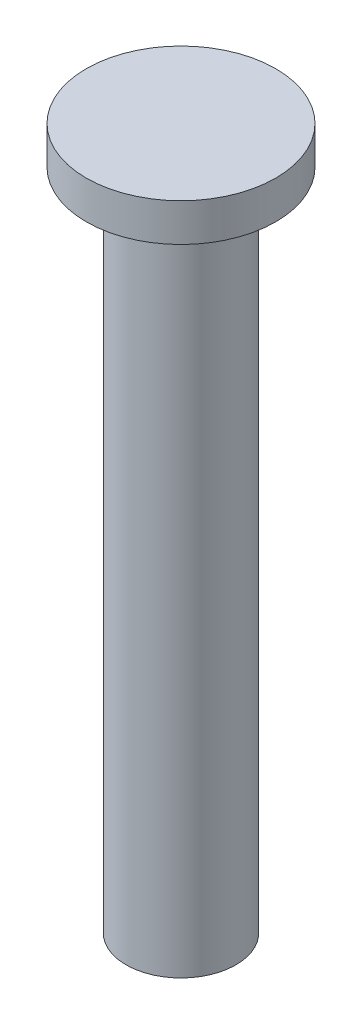
ISO-10303-21;
HEADER;
FILE_DESCRIPTION(('STEP AP214'),'2;1');
FILE_NAME('part.step','',(''),(''),'','','');
FILE_SCHEMA(('AUTOMOTIVE_DESIGN { 1 0 10303 214 1 1 1 1 }'));
ENDSEC;
DATA;
#1=APPLICATION_CONTEXT('core data for automotive mechanical design processes');
#2=APPLICATION_PROTOCOL_DEFINITION('international standard','automotive_design',2000,#1);
#3=PRODUCT_CONTEXT('',#1,'mechanical');
#4=PRODUCT('Part','Part','',(#3));
#5=PRODUCT_RELATED_PRODUCT_CATEGORY('part','',(#4));
#6=PRODUCT_DEFINITION_FORMATION('','',#4);
#7=PRODUCT_DEFINITION_CONTEXT('part definition',#1,'design');
#8=PRODUCT_DEFINITION('design','',#6,#7);
#9=PRODUCT_DEFINITION_SHAPE('','',#8);
#10=(LENGTH_UNIT() NAMED_UNIT(*) SI_UNIT(.MILLI.,.METRE.));
#11=(NAMED_UNIT(*) PLANE_ANGLE_UNIT() SI_UNIT($,.RADIAN.));
#12=(NAMED_UNIT(*) SI_UNIT($,.STERADIAN.) SOLID_ANGLE_UNIT());
#13=UNCERTAINTY_MEASURE_WITH_UNIT(LENGTH_MEASURE(1.E-05),#10,'distance_accuracy_value','');
#14=(GEOMETRIC_REPRESENTATION_CONTEXT(3) GLOBAL_UNCERTAINTY_ASSIGNED_CONTEXT((#13)) GLOBAL_UNIT_ASSIGNED_CONTEXT((#10,
#11,#12)) REPRESENTATION_CONTEXT('',''));
#15=CARTESIAN_POINT('',(0.,0.,0.));
#16=DIRECTION('',(0.,0.,1.));
#17=DIRECTION('',(1.,0.,0.));
#18=AXIS2_PLACEMENT_3D('',#15,#16,#17);
#19=CARTESIAN_POINT('',(0.,37.,0.));
#20=DIRECTION('',(0.,1.,0.));
#21=DIRECTION('',(0.,0.,1.));
#22=AXIS2_PLACEMENT_3D('',#19,#20,#21);
#23=PLANE('',#22);
#24=CARTESIAN_POINT('',(0.,37.,0.));
#25=DIRECTION('',(0.,-1.,0.));
#26=DIRECTION('',(0.,0.,-1.));
#27=AXIS2_PLACEMENT_3D('',#24,#25,#26);
#28=CIRCLE('',#27,5.);
#29=CARTESIAN_POINT('',(0.,37.,-5.));
#30=VERTEX_POINT('',#29);
#31=EDGE_CURVE('E10',#30,#30,#28,.T.);
#32=ORIENTED_EDGE('',*,*,#31,.F.);
#33=EDGE_LOOP('',(#32));
#34=FACE_BOUND('',#33,.T.);
#35=ADVANCED_FACE('F30',(#34),#23,.T.);
#36=CARTESIAN_POINT('',(0.,0.,0.));
#37=DIRECTION('',(0.,-1.,0.));
#38=DIRECTION('',(0.,0.,-1.));
#39=AXIS2_PLACEMENT_3D('',#36,#37,#38);
#40=CYLINDRICAL_SURFACE('',#39,5.);
#41=ORIENTED_EDGE('',*,*,#31,.T.);
#42=EDGE_LOOP('',(#41));
#43=FACE_BOUND('',#42,.T.);
#44=CARTESIAN_POINT('',(0.,35.,0.));
#45=DIRECTION('',(0.,-1.,0.));
#46=DIRECTION('',(0.,0.,-1.));
#47=AXIS2_PLACEMENT_3D('',#44,#45,#46);
#48=CIRCLE('',#47,5.);
#49=CARTESIAN_POINT('',(0.,35.,-5.));
#50=VERTEX_POINT('',#49);
#51=EDGE_CURVE('E36',#50,#50,#48,.T.);
#52=ORIENTED_EDGE('',*,*,#51,.F.);
#53=EDGE_LOOP('',(#52));
#54=FACE_BOUND('',#53,.T.);
#55=ADVANCED_FACE('F62',(#43,#54),#40,.T.);
#56=CARTESIAN_POINT('',(5.,35.,0.));
#57=DIRECTION('',(0.,-1.,0.));
#58=DIRECTION('',(0.,0.,-1.));
#59=AXIS2_PLACEMENT_3D('',#56,#57,#58);
#60=PLANE('',#59);
#61=ORIENTED_EDGE('',*,*,#51,.T.);
#62=EDGE_LOOP('',(#61));
#63=FACE_BOUND('',#62,.T.);
#64=CARTESIAN_POINT('',(0.,35.,0.));
#65=DIRECTION('',(0.,-1.,0.));
#66=DIRECTION('',(0.,0.,-1.));
#67=AXIS2_PLACEMENT_3D('',#64,#65,#66);
#68=CIRCLE('',#67,2.9);
#69=CARTESIAN_POINT('',(0.,35.,-2.9));
#70=VERTEX_POINT('',#69);
#71=EDGE_CURVE('E40',#70,#70,#68,.T.);
#72=ORIENTED_EDGE('',*,*,#71,.F.);
#73=EDGE_LOOP('',(#72));
#74=FACE_BOUND('',#73,.T.);
#75=ADVANCED_FACE('F54',(#63,#74),#60,.T.);
#76=CARTESIAN_POINT('',(0.,0.,0.));
#77=DIRECTION('',(0.,-1.,0.));
#78=DIRECTION('',(0.,0.,-1.));
#79=AXIS2_PLACEMENT_3D('',#76,#77,#78);
#80=CYLINDRICAL_SURFACE('',#79,2.9);
#81=ORIENTED_EDGE('',*,*,#71,.T.);
#82=EDGE_LOOP('',(#81));
#83=FACE_BOUND('',#82,.T.);
#84=CARTESIAN_POINT('',(0.,0.,0.));
#85=DIRECTION('',(0.,-1.,0.));
#86=DIRECTION('',(0.,0.,-1.));
#87=AXIS2_PLACEMENT_3D('',#84,#85,#86);
#88=CIRCLE('',#87,2.9);
#89=CARTESIAN_POINT('',(0.,0.,-2.9));
#90=VERTEX_POINT('',#89);
#91=EDGE_CURVE('E44',#90,#90,#88,.T.);
#92=ORIENTED_EDGE('',*,*,#91,.F.);
#93=EDGE_LOOP('',(#92));
#94=FACE_BOUND('',#93,.T.);
#95=ADVANCED_FACE('F52',(#83,#94),#80,.T.);
#96=CARTESIAN_POINT('',(2.9,0.,0.));
#97=DIRECTION('',(0.,-1.,0.));
#98=DIRECTION('',(0.,0.,-1.));
#99=AXIS2_PLACEMENT_3D('',#96,#97,#98);
#100=PLANE('',#99);
#101=ORIENTED_EDGE('',*,*,#91,.T.);
#102=EDGE_LOOP('',(#101));
#103=FACE_BOUND('',#102,.T.);
#104=ADVANCED_FACE('F50',(#103),#100,.T.);
#105=CLOSED_SHELL('',(#35,#55,#75,#95,#104));
#106=MANIFOLD_SOLID_BREP('B2',#105);
#107=ADVANCED_BREP_SHAPE_REPRESENTATION('',(#18,#106),#14);
#108=SHAPE_DEFINITION_REPRESENTATION(#9,#107);
ENDSEC;
END-ISO-10303-21;
